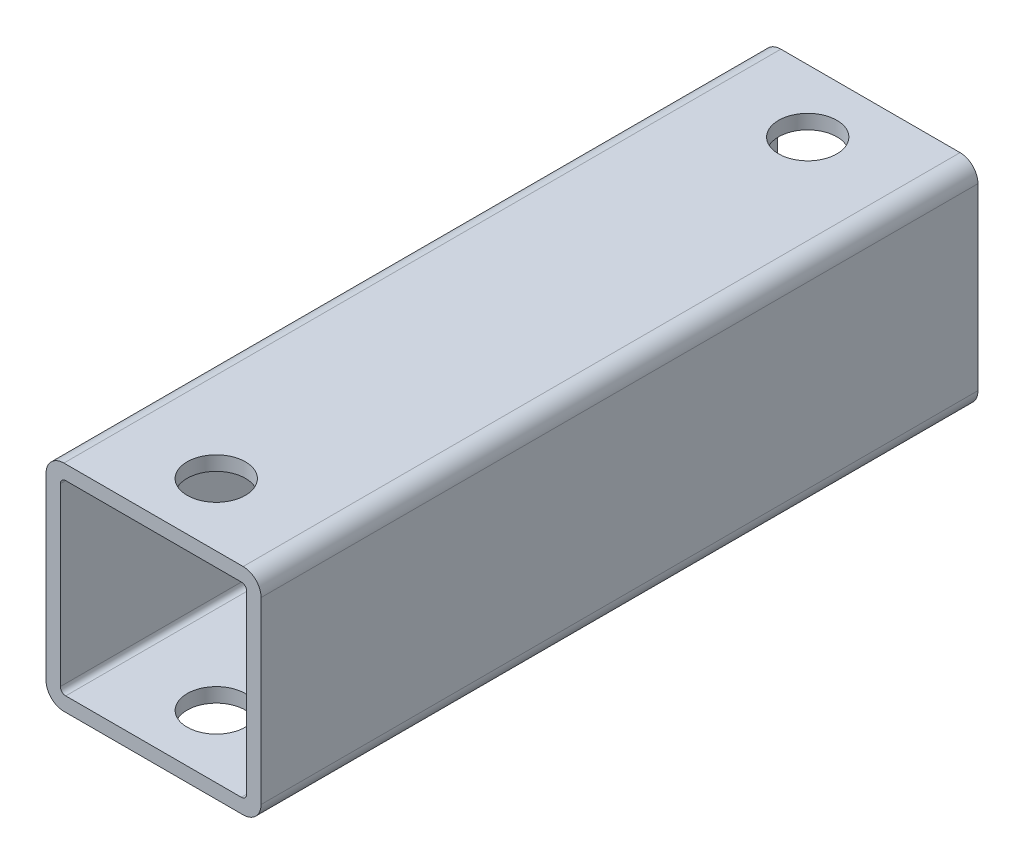
ISO-10303-21;
HEADER;
FILE_DESCRIPTION(('STEP AP214'),'2;1');
FILE_NAME('part.step','',(''),(''),'','','');
FILE_SCHEMA(('AUTOMOTIVE_DESIGN { 1 0 10303 214 1 1 1 1 }'));
ENDSEC;
DATA;
#1=APPLICATION_CONTEXT('core data for automotive mechanical design processes');
#2=APPLICATION_PROTOCOL_DEFINITION('international standard','automotive_design',2000,#1);
#3=PRODUCT_CONTEXT('',#1,'mechanical');
#4=PRODUCT('Part','Part','',(#3));
#5=PRODUCT_RELATED_PRODUCT_CATEGORY('part','',(#4));
#6=PRODUCT_DEFINITION_FORMATION('','',#4);
#7=PRODUCT_DEFINITION_CONTEXT('part definition',#1,'design');
#8=PRODUCT_DEFINITION('design','',#6,#7);
#9=PRODUCT_DEFINITION_SHAPE('','',#8);
#10=(LENGTH_UNIT() NAMED_UNIT(*) SI_UNIT(.MILLI.,.METRE.));
#11=(NAMED_UNIT(*) PLANE_ANGLE_UNIT() SI_UNIT($,.RADIAN.));
#12=(NAMED_UNIT(*) SI_UNIT($,.STERADIAN.) SOLID_ANGLE_UNIT());
#13=UNCERTAINTY_MEASURE_WITH_UNIT(LENGTH_MEASURE(1.E-05),#10,'distance_accuracy_value','');
#14=(GEOMETRIC_REPRESENTATION_CONTEXT(3) GLOBAL_UNCERTAINTY_ASSIGNED_CONTEXT((#13)) GLOBAL_UNIT_ASSIGNED_CONTEXT((#10,
#11,#12)) REPRESENTATION_CONTEXT('',''));
#15=CARTESIAN_POINT('',(0.,0.,0.));
#16=DIRECTION('',(0.,0.,1.));
#17=DIRECTION('',(1.,0.,0.));
#18=AXIS2_PLACEMENT_3D('',#15,#16,#17);
#19=CARTESIAN_POINT('',(-12.5,5.,71.));
#20=DIRECTION('',(0.,0.,-1.));
#21=DIRECTION('',(-1.,0.,0.));
#22=AXIS2_PLACEMENT_3D('',#19,#20,#21);
#23=CYLINDRICAL_SURFACE('',#22,0.999999999999998);
#24=CARTESIAN_POINT('',(-12.5,5.,71.));
#25=DIRECTION('',(0.,0.,-1.));
#26=DIRECTION('',(-1.,0.,0.));
#27=AXIS2_PLACEMENT_3D('',#24,#25,#26);
#28=CIRCLE('',#27,0.999999999999998);
#29=CARTESIAN_POINT('',(-13.5,5.,71.));
#30=VERTEX_POINT('',#29);
#31=CARTESIAN_POINT('',(-12.5,6.,71.));
#32=VERTEX_POINT('',#31);
#33=EDGE_CURVE('E95',#30,#32,#28,.T.);
#34=ORIENTED_EDGE('',*,*,#33,.T.);
#35=DIRECTION('',(0.,0.,1.));
#36=VECTOR('',#35,1.);
#37=CARTESIAN_POINT('',(-12.5,6.,51.));
#38=LINE('',#37,#36);
#39=CARTESIAN_POINT('',(-12.5,6.,31.));
#40=VERTEX_POINT('',#39);
#41=EDGE_CURVE('E92',#32,#40,#38,.F.);
#42=ORIENTED_EDGE('',*,*,#41,.T.);
#43=CARTESIAN_POINT('',(-12.5,5.,31.));
#44=DIRECTION('',(0.,0.,-1.));
#45=DIRECTION('',(-1.,0.,0.));
#46=AXIS2_PLACEMENT_3D('',#43,#44,#45);
#47=CIRCLE('',#46,0.999999999999998);
#48=CARTESIAN_POINT('',(-13.5,5.,31.));
#49=VERTEX_POINT('',#48);
#50=EDGE_CURVE('E21',#49,#40,#47,.T.);
#51=ORIENTED_EDGE('',*,*,#50,.F.);
#52=DIRECTION('',(0.,0.,-1.));
#53=VECTOR('',#52,1.);
#54=CARTESIAN_POINT('',(-13.5,5.,51.));
#55=LINE('',#54,#53);
#56=EDGE_CURVE('E159',#49,#30,#55,.F.);
#57=ORIENTED_EDGE('',*,*,#56,.T.);
#58=EDGE_LOOP('',(#34,#42,#51,#57));
#59=FACE_BOUND('',#58,.T.);
#60=ADVANCED_FACE('F17',(#59),#23,.T.);
#61=CARTESIAN_POINT('',(-12.5,-5.,71.));
#62=DIRECTION('',(0.,0.,-1.));
#63=DIRECTION('',(-1.,0.,0.));
#64=AXIS2_PLACEMENT_3D('',#61,#62,#63);
#65=CYLINDRICAL_SURFACE('',#64,1.);
#66=CARTESIAN_POINT('',(-12.5,-5.,71.));
#67=DIRECTION('',(0.,0.,-1.));
#68=DIRECTION('',(-1.,0.,0.));
#69=AXIS2_PLACEMENT_3D('',#66,#67,#68);
#70=CIRCLE('',#69,1.);
#71=CARTESIAN_POINT('',(-12.5,-6.,71.));
#72=VERTEX_POINT('',#71);
#73=CARTESIAN_POINT('',(-13.5,-5.,71.));
#74=VERTEX_POINT('',#73);
#75=EDGE_CURVE('E210',#72,#74,#70,.T.);
#76=ORIENTED_EDGE('',*,*,#75,.T.);
#77=DIRECTION('',(0.,0.,1.));
#78=VECTOR('',#77,1.);
#79=CARTESIAN_POINT('',(-13.5,-5.,51.));
#80=LINE('',#79,#78);
#81=CARTESIAN_POINT('',(-13.5,-5.,31.));
#82=VERTEX_POINT('',#81);
#83=EDGE_CURVE('E158',#74,#82,#80,.F.);
#84=ORIENTED_EDGE('',*,*,#83,.T.);
#85=CARTESIAN_POINT('',(-12.5,-5.,31.));
#86=DIRECTION('',(0.,0.,-1.));
#87=DIRECTION('',(-1.,0.,0.));
#88=AXIS2_PLACEMENT_3D('',#85,#86,#87);
#89=CIRCLE('',#88,1.);
#90=CARTESIAN_POINT('',(-12.5,-6.,31.));
#91=VERTEX_POINT('',#90);
#92=EDGE_CURVE('E89',#91,#82,#89,.T.);
#93=ORIENTED_EDGE('',*,*,#92,.F.);
#94=DIRECTION('',(0.,0.,-1.));
#95=VECTOR('',#94,1.);
#96=CARTESIAN_POINT('',(-12.5,-6.,51.));
#97=LINE('',#96,#95);
#98=EDGE_CURVE('E151',#91,#72,#97,.F.);
#99=ORIENTED_EDGE('',*,*,#98,.T.);
#100=EDGE_LOOP('',(#76,#84,#93,#99));
#101=FACE_BOUND('',#100,.T.);
#102=ADVANCED_FACE('F235',(#101),#65,.T.);
#103=CARTESIAN_POINT('',(-2.5,5.,71.));
#104=DIRECTION('',(0.,0.,-1.));
#105=DIRECTION('',(-1.,0.,0.));
#106=AXIS2_PLACEMENT_3D('',#103,#104,#105);
#107=CYLINDRICAL_SURFACE('',#106,1.);
#108=CARTESIAN_POINT('',(-2.5,5.,71.));
#109=DIRECTION('',(0.,0.,-1.));
#110=DIRECTION('',(-1.,0.,0.));
#111=AXIS2_PLACEMENT_3D('',#108,#109,#110);
#112=CIRCLE('',#111,1.);
#113=CARTESIAN_POINT('',(-2.5,6.,71.));
#114=VERTEX_POINT('',#113);
#115=CARTESIAN_POINT('',(-1.5,5.,71.));
#116=VERTEX_POINT('',#115);
#117=EDGE_CURVE('E216',#114,#116,#112,.T.);
#118=ORIENTED_EDGE('',*,*,#117,.T.);
#119=DIRECTION('',(0.,0.,1.));
#120=VECTOR('',#119,1.);
#121=CARTESIAN_POINT('',(-1.5,5.,51.));
#122=LINE('',#121,#120);
#123=CARTESIAN_POINT('',(-1.5,5.,31.));
#124=VERTEX_POINT('',#123);
#125=EDGE_CURVE('E147',#116,#124,#122,.F.);
#126=ORIENTED_EDGE('',*,*,#125,.T.);
#127=CARTESIAN_POINT('',(-2.5,5.,31.));
#128=DIRECTION('',(0.,0.,-1.));
#129=DIRECTION('',(-1.,0.,0.));
#130=AXIS2_PLACEMENT_3D('',#127,#128,#129);
#131=CIRCLE('',#130,1.);
#132=CARTESIAN_POINT('',(-2.5,6.,31.));
#133=VERTEX_POINT('',#132);
#134=EDGE_CURVE('E229',#133,#124,#131,.T.);
#135=ORIENTED_EDGE('',*,*,#134,.F.);
#136=DIRECTION('',(0.,0.,-1.));
#137=VECTOR('',#136,1.);
#138=CARTESIAN_POINT('',(-2.5,6.,51.));
#139=LINE('',#138,#137);
#140=EDGE_CURVE('E105',#133,#114,#139,.F.);
#141=ORIENTED_EDGE('',*,*,#140,.T.);
#142=EDGE_LOOP('',(#118,#126,#135,#141));
#143=FACE_BOUND('',#142,.T.);
#144=ADVANCED_FACE('F297',(#143),#107,.T.);
#145=CARTESIAN_POINT('',(-2.5,-5.,71.));
#146=DIRECTION('',(0.,0.,-1.));
#147=DIRECTION('',(-1.,0.,0.));
#148=AXIS2_PLACEMENT_3D('',#145,#146,#147);
#149=CYLINDRICAL_SURFACE('',#148,1.);
#150=CARTESIAN_POINT('',(-2.5,-5.,71.));
#151=DIRECTION('',(0.,0.,-1.));
#152=DIRECTION('',(-1.,0.,0.));
#153=AXIS2_PLACEMENT_3D('',#150,#151,#152);
#154=CIRCLE('',#153,1.);
#155=CARTESIAN_POINT('',(-1.5,-5.,71.));
#156=VERTEX_POINT('',#155);
#157=CARTESIAN_POINT('',(-2.5,-6.,71.));
#158=VERTEX_POINT('',#157);
#159=EDGE_CURVE('E213',#156,#158,#154,.T.);
#160=ORIENTED_EDGE('',*,*,#159,.T.);
#161=DIRECTION('',(0.,0.,1.));
#162=VECTOR('',#161,1.);
#163=CARTESIAN_POINT('',(-2.5,-6.,51.));
#164=LINE('',#163,#162);
#165=CARTESIAN_POINT('',(-2.5,-6.,31.));
#166=VERTEX_POINT('',#165);
#167=EDGE_CURVE('E155',#158,#166,#164,.F.);
#168=ORIENTED_EDGE('',*,*,#167,.T.);
#169=CARTESIAN_POINT('',(-2.5,-5.,31.));
#170=DIRECTION('',(0.,0.,-1.));
#171=DIRECTION('',(-1.,0.,0.));
#172=AXIS2_PLACEMENT_3D('',#169,#170,#171);
#173=CIRCLE('',#172,1.);
#174=CARTESIAN_POINT('',(-1.5,-5.,31.));
#175=VERTEX_POINT('',#174);
#176=EDGE_CURVE('E227',#175,#166,#173,.T.);
#177=ORIENTED_EDGE('',*,*,#176,.F.);
#178=DIRECTION('',(0.,0.,-1.));
#179=VECTOR('',#178,1.);
#180=CARTESIAN_POINT('',(-1.5,-5.,51.));
#181=LINE('',#180,#179);
#182=EDGE_CURVE('E144',#175,#156,#181,.F.);
#183=ORIENTED_EDGE('',*,*,#182,.T.);
#184=EDGE_LOOP('',(#160,#168,#177,#183));
#185=FACE_BOUND('',#184,.T.);
#186=ADVANCED_FACE('F295',(#185),#149,.T.);
#187=CARTESIAN_POINT('',(-2.6,-4.9,31.));
#188=DIRECTION('',(0.,0.,1.));
#189=DIRECTION('',(1.,0.,0.));
#190=AXIS2_PLACEMENT_3D('',#187,#188,#189);
#191=CYLINDRICAL_SURFACE('',#190,0.3);
#192=DIRECTION('',(0.,0.,1.));
#193=VECTOR('',#192,1.);
#194=CARTESIAN_POINT('',(-2.3,-4.9,51.));
#195=LINE('',#194,#193);
#196=CARTESIAN_POINT('',(-2.3,-4.9,71.));
#197=VERTEX_POINT('',#196);
#198=CARTESIAN_POINT('',(-2.3,-4.9,31.));
#199=VERTEX_POINT('',#198);
#200=EDGE_CURVE('E140',#197,#199,#195,.F.);
#201=ORIENTED_EDGE('',*,*,#200,.T.);
#202=CARTESIAN_POINT('',(-2.6,-4.9,31.));
#203=DIRECTION('',(0.,0.,1.));
#204=DIRECTION('',(1.,0.,0.));
#205=AXIS2_PLACEMENT_3D('',#202,#203,#204);
#206=CIRCLE('',#205,0.3);
#207=CARTESIAN_POINT('',(-2.6,-5.2,31.));
#208=VERTEX_POINT('',#207);
#209=EDGE_CURVE('E225',#208,#199,#206,.T.);
#210=ORIENTED_EDGE('',*,*,#209,.F.);
#211=DIRECTION('',(0.,0.,-1.));
#212=VECTOR('',#211,1.);
#213=CARTESIAN_POINT('',(-2.6,-5.2,51.));
#214=LINE('',#213,#212);
#215=CARTESIAN_POINT('',(-2.6,-5.2,71.));
#216=VERTEX_POINT('',#215);
#217=EDGE_CURVE('E129',#208,#216,#214,.F.);
#218=ORIENTED_EDGE('',*,*,#217,.T.);
#219=CARTESIAN_POINT('',(-2.6,-4.9,71.));
#220=DIRECTION('',(0.,0.,1.));
#221=DIRECTION('',(1.,0.,0.));
#222=AXIS2_PLACEMENT_3D('',#219,#220,#221);
#223=CIRCLE('',#222,0.3);
#224=EDGE_CURVE('E206',#216,#197,#223,.T.);
#225=ORIENTED_EDGE('',*,*,#224,.T.);
#226=EDGE_LOOP('',(#201,#210,#218,#225));
#227=FACE_BOUND('',#226,.T.);
#228=ADVANCED_FACE('F305',(#227),#191,.F.);
#229=CARTESIAN_POINT('',(-7.5,-6.,34.5));
#230=DIRECTION('',(0.,1.,0.));
#231=DIRECTION('',(0.,0.,1.));
#232=AXIS2_PLACEMENT_3D('',#229,#230,#231);
#233=CYLINDRICAL_SURFACE('',#232,1.62499999999999);
#234=CARTESIAN_POINT('',(-7.5,-6.,34.5));
#235=DIRECTION('',(0.,1.,0.));
#236=DIRECTION('',(0.,0.,1.));
#237=AXIS2_PLACEMENT_3D('',#234,#235,#236);
#238=CIRCLE('',#237,1.62499999999999);
#239=CARTESIAN_POINT('',(-7.5,-6.,36.125));
#240=VERTEX_POINT('',#239);
#241=EDGE_CURVE('E180',#240,#240,#238,.F.);
#242=ORIENTED_EDGE('',*,*,#241,.T.);
#243=EDGE_LOOP('',(#242));
#244=FACE_BOUND('',#243,.T.);
#245=CARTESIAN_POINT('',(-7.5,-5.2,34.5));
#246=DIRECTION('',(0.,1.,0.));
#247=DIRECTION('',(0.,0.,1.));
#248=AXIS2_PLACEMENT_3D('',#245,#246,#247);
#249=CIRCLE('',#248,1.62499999999999);
#250=CARTESIAN_POINT('',(-7.5,-5.2,36.125));
#251=VERTEX_POINT('',#250);
#252=EDGE_CURVE('E173',#251,#251,#249,.T.);
#253=ORIENTED_EDGE('',*,*,#252,.T.);
#254=EDGE_LOOP('',(#253));
#255=FACE_BOUND('',#254,.T.);
#256=ADVANCED_FACE('F375',(#244,#255),#233,.F.);
#257=CARTESIAN_POINT('',(-7.5,-6.,67.5));
#258=DIRECTION('',(0.,1.,0.));
#259=DIRECTION('',(0.,0.,1.));
#260=AXIS2_PLACEMENT_3D('',#257,#258,#259);
#261=CYLINDRICAL_SURFACE('',#260,1.625);
#262=CARTESIAN_POINT('',(-7.5,-6.,67.5));
#263=DIRECTION('',(0.,1.,0.));
#264=DIRECTION('',(0.,0.,1.));
#265=AXIS2_PLACEMENT_3D('',#262,#263,#264);
#266=CIRCLE('',#265,1.625);
#267=CARTESIAN_POINT('',(-7.5,-6.,69.125));
#268=VERTEX_POINT('',#267);
#269=EDGE_CURVE('E150',#268,#268,#266,.F.);
#270=ORIENTED_EDGE('',*,*,#269,.T.);
#271=EDGE_LOOP('',(#270));
#272=FACE_BOUND('',#271,.T.);
#273=CARTESIAN_POINT('',(-7.5,-5.2,67.5));
#274=DIRECTION('',(0.,1.,0.));
#275=DIRECTION('',(0.,0.,1.));
#276=AXIS2_PLACEMENT_3D('',#273,#274,#275);
#277=CIRCLE('',#276,1.625);
#278=CARTESIAN_POINT('',(-7.5,-5.2,69.125));
#279=VERTEX_POINT('',#278);
#280=EDGE_CURVE('E126',#279,#279,#277,.T.);
#281=ORIENTED_EDGE('',*,*,#280,.T.);
#282=EDGE_LOOP('',(#281));
#283=FACE_BOUND('',#282,.T.);
#284=ADVANCED_FACE('F385',(#272,#283),#261,.F.);
#285=CARTESIAN_POINT('',(-12.4,-4.9,31.));
#286=DIRECTION('',(0.,0.,1.));
#287=DIRECTION('',(1.,0.,0.));
#288=AXIS2_PLACEMENT_3D('',#285,#286,#287);
#289=CYLINDRICAL_SURFACE('',#288,0.299999999999998);
#290=DIRECTION('',(0.,0.,1.));
#291=VECTOR('',#290,1.);
#292=CARTESIAN_POINT('',(-12.4,-5.2,51.));
#293=LINE('',#292,#291);
#294=CARTESIAN_POINT('',(-12.4,-5.2,71.));
#295=VERTEX_POINT('',#294);
#296=CARTESIAN_POINT('',(-12.4,-5.2,31.));
#297=VERTEX_POINT('',#296);
#298=EDGE_CURVE('E133',#295,#297,#293,.F.);
#299=ORIENTED_EDGE('',*,*,#298,.T.);
#300=CARTESIAN_POINT('',(-12.4,-4.9,31.));
#301=DIRECTION('',(0.,0.,1.));
#302=DIRECTION('',(1.,0.,0.));
#303=AXIS2_PLACEMENT_3D('',#300,#301,#302);
#304=CIRCLE('',#303,0.299999999999998);
#305=CARTESIAN_POINT('',(-12.7,-4.9,31.));
#306=VERTEX_POINT('',#305);
#307=EDGE_CURVE('E223',#306,#297,#304,.T.);
#308=ORIENTED_EDGE('',*,*,#307,.F.);
#309=DIRECTION('',(0.,0.,-1.));
#310=VECTOR('',#309,1.);
#311=CARTESIAN_POINT('',(-12.7,-4.9,51.));
#312=LINE('',#311,#310);
#313=CARTESIAN_POINT('',(-12.7,-4.9,71.));
#314=VERTEX_POINT('',#313);
#315=EDGE_CURVE('E122',#306,#314,#312,.F.);
#316=ORIENTED_EDGE('',*,*,#315,.T.);
#317=CARTESIAN_POINT('',(-12.4,-4.9,71.));
#318=DIRECTION('',(0.,0.,1.));
#319=DIRECTION('',(1.,0.,0.));
#320=AXIS2_PLACEMENT_3D('',#317,#318,#319);
#321=CIRCLE('',#320,0.299999999999998);
#322=EDGE_CURVE('E165',#314,#295,#321,.T.);
#323=ORIENTED_EDGE('',*,*,#322,.T.);
#324=EDGE_LOOP('',(#299,#308,#316,#323));
#325=FACE_BOUND('',#324,.T.);
#326=ADVANCED_FACE('F395',(#325),#289,.F.);
#327=CARTESIAN_POINT('',(-2.6,4.9,31.));
#328=DIRECTION('',(0.,0.,1.));
#329=DIRECTION('',(1.,0.,0.));
#330=AXIS2_PLACEMENT_3D('',#327,#328,#329);
#331=CYLINDRICAL_SURFACE('',#330,0.3);
#332=DIRECTION('',(0.,0.,1.));
#333=VECTOR('',#332,1.);
#334=CARTESIAN_POINT('',(-2.6,5.2,51.));
#335=LINE('',#334,#333);
#336=CARTESIAN_POINT('',(-2.6,5.2,71.));
#337=VERTEX_POINT('',#336);
#338=CARTESIAN_POINT('',(-2.6,5.2,31.));
#339=VERTEX_POINT('',#338);
#340=EDGE_CURVE('E119',#337,#339,#335,.F.);
#341=ORIENTED_EDGE('',*,*,#340,.T.);
#342=CARTESIAN_POINT('',(-2.6,4.9,31.));
#343=DIRECTION('',(0.,0.,1.));
#344=DIRECTION('',(1.,0.,0.));
#345=AXIS2_PLACEMENT_3D('',#342,#343,#344);
#346=CIRCLE('',#345,0.3);
#347=CARTESIAN_POINT('',(-2.3,4.9,31.));
#348=VERTEX_POINT('',#347);
#349=EDGE_CURVE('E36',#348,#339,#346,.T.);
#350=ORIENTED_EDGE('',*,*,#349,.F.);
#351=DIRECTION('',(0.,0.,-1.));
#352=VECTOR('',#351,1.);
#353=CARTESIAN_POINT('',(-2.3,4.9,51.));
#354=LINE('',#353,#352);
#355=CARTESIAN_POINT('',(-2.3,4.9,71.));
#356=VERTEX_POINT('',#355);
#357=EDGE_CURVE('E137',#348,#356,#354,.F.);
#358=ORIENTED_EDGE('',*,*,#357,.T.);
#359=CARTESIAN_POINT('',(-2.6,4.9,71.));
#360=DIRECTION('',(0.,0.,1.));
#361=DIRECTION('',(1.,0.,0.));
#362=AXIS2_PLACEMENT_3D('',#359,#360,#361);
#363=CIRCLE('',#362,0.3);
#364=EDGE_CURVE('E203',#356,#337,#363,.T.);
#365=ORIENTED_EDGE('',*,*,#364,.T.);
#366=EDGE_LOOP('',(#341,#350,#358,#365));
#367=FACE_BOUND('',#366,.T.);
#368=ADVANCED_FACE('F405',(#367),#331,.F.);
#369=CARTESIAN_POINT('',(-12.4,4.9,31.));
#370=DIRECTION('',(0.,0.,1.));
#371=DIRECTION('',(1.,0.,0.));
#372=AXIS2_PLACEMENT_3D('',#369,#370,#371);
#373=CYLINDRICAL_SURFACE('',#372,0.3);
#374=DIRECTION('',(0.,0.,1.));
#375=VECTOR('',#374,1.);
#376=CARTESIAN_POINT('',(-12.7,4.9,51.));
#377=LINE('',#376,#375);
#378=CARTESIAN_POINT('',(-12.7,4.9,71.));
#379=VERTEX_POINT('',#378);
#380=CARTESIAN_POINT('',(-12.7,4.9,31.));
#381=VERTEX_POINT('',#380);
#382=EDGE_CURVE('E121',#379,#381,#377,.F.);
#383=ORIENTED_EDGE('',*,*,#382,.T.);
#384=CARTESIAN_POINT('',(-12.4,4.9,31.));
#385=DIRECTION('',(0.,0.,1.));
#386=DIRECTION('',(1.,0.,0.));
#387=AXIS2_PLACEMENT_3D('',#384,#385,#386);
#388=CIRCLE('',#387,0.3);
#389=CARTESIAN_POINT('',(-12.4,5.2,31.));
#390=VERTEX_POINT('',#389);
#391=EDGE_CURVE('E219',#390,#381,#388,.T.);
#392=ORIENTED_EDGE('',*,*,#391,.F.);
#393=DIRECTION('',(0.,0.,-1.));
#394=VECTOR('',#393,1.);
#395=CARTESIAN_POINT('',(-12.4,5.2,51.));
#396=LINE('',#395,#394);
#397=CARTESIAN_POINT('',(-12.4,5.2,71.));
#398=VERTEX_POINT('',#397);
#399=EDGE_CURVE('E115',#390,#398,#396,.F.);
#400=ORIENTED_EDGE('',*,*,#399,.T.);
#401=CARTESIAN_POINT('',(-12.4,4.9,71.));
#402=DIRECTION('',(0.,0.,1.));
#403=DIRECTION('',(1.,0.,0.));
#404=AXIS2_PLACEMENT_3D('',#401,#402,#403);
#405=CIRCLE('',#404,0.3);
#406=EDGE_CURVE('E200',#398,#379,#405,.T.);
#407=ORIENTED_EDGE('',*,*,#406,.T.);
#408=EDGE_LOOP('',(#383,#392,#400,#407));
#409=FACE_BOUND('',#408,.T.);
#410=ADVANCED_FACE('F268',(#409),#373,.F.);
#411=CARTESIAN_POINT('',(-13.74,6.24,71.));
#412=DIRECTION('',(0.,0.,1.));
#413=DIRECTION('',(0.,-1.,0.));
#414=AXIS2_PLACEMENT_3D('',#411,#412,#413);
#415=PLANE('',#414);
#416=DIRECTION('',(0.,-1.,0.));
#417=VECTOR('',#416,1.);
#418=CARTESIAN_POINT('',(-12.7,0.,71.));
#419=LINE('',#418,#417);
#420=EDGE_CURVE('E125',#314,#379,#419,.F.);
#421=ORIENTED_EDGE('',*,*,#420,.T.);
#422=ORIENTED_EDGE('',*,*,#406,.F.);
#423=DIRECTION('',(-1.,0.,0.));
#424=VECTOR('',#423,1.);
#425=CARTESIAN_POINT('',(-7.5,5.2,71.));
#426=LINE('',#425,#424);
#427=EDGE_CURVE('E118',#398,#337,#426,.F.);
#428=ORIENTED_EDGE('',*,*,#427,.T.);
#429=ORIENTED_EDGE('',*,*,#364,.F.);
#430=DIRECTION('',(0.,1.,0.));
#431=VECTOR('',#430,1.);
#432=CARTESIAN_POINT('',(-2.3,0.,71.));
#433=LINE('',#432,#431);
#434=EDGE_CURVE('E136',#356,#197,#433,.F.);
#435=ORIENTED_EDGE('',*,*,#434,.T.);
#436=ORIENTED_EDGE('',*,*,#224,.F.);
#437=DIRECTION('',(1.,0.,0.));
#438=VECTOR('',#437,1.);
#439=CARTESIAN_POINT('',(-7.5,-5.2,71.));
#440=LINE('',#439,#438);
#441=EDGE_CURVE('E132',#216,#295,#440,.F.);
#442=ORIENTED_EDGE('',*,*,#441,.T.);
#443=ORIENTED_EDGE('',*,*,#322,.F.);
#444=EDGE_LOOP('',(#421,#422,#428,#429,#435,#436,#442,#443));
#445=FACE_BOUND('',#444,.T.);
#446=ORIENTED_EDGE('',*,*,#33,.F.);
#447=DIRECTION('',(0.,1.,0.));
#448=VECTOR('',#447,1.);
#449=CARTESIAN_POINT('',(-13.5,0.,71.));
#450=LINE('',#449,#448);
#451=EDGE_CURVE('E161',#30,#74,#450,.F.);
#452=ORIENTED_EDGE('',*,*,#451,.T.);
#453=ORIENTED_EDGE('',*,*,#75,.F.);
#454=DIRECTION('',(-1.,0.,0.));
#455=VECTOR('',#454,1.);
#456=CARTESIAN_POINT('',(-7.5,-6.,71.));
#457=LINE('',#456,#455);
#458=EDGE_CURVE('E154',#72,#158,#457,.F.);
#459=ORIENTED_EDGE('',*,*,#458,.T.);
#460=ORIENTED_EDGE('',*,*,#159,.F.);
#461=DIRECTION('',(0.,-1.,0.));
#462=VECTOR('',#461,1.);
#463=CARTESIAN_POINT('',(-1.5,0.,71.));
#464=LINE('',#463,#462);
#465=EDGE_CURVE('E143',#156,#116,#464,.F.);
#466=ORIENTED_EDGE('',*,*,#465,.T.);
#467=ORIENTED_EDGE('',*,*,#117,.F.);
#468=DIRECTION('',(1.,0.,0.));
#469=VECTOR('',#468,1.);
#470=CARTESIAN_POINT('',(-7.5,6.,71.));
#471=LINE('',#470,#469);
#472=EDGE_CURVE('E100',#114,#32,#471,.F.);
#473=ORIENTED_EDGE('',*,*,#472,.T.);
#474=EDGE_LOOP('',(#446,#452,#453,#459,#460,#466,#467,#473));
#475=FACE_BOUND('',#474,.T.);
#476=ADVANCED_FACE('F288',(#445,#475),#415,.T.);
#477=CARTESIAN_POINT('',(-7.5,5.2,34.5));
#478=DIRECTION('',(0.,1.,0.));
#479=DIRECTION('',(0.,0.,1.));
#480=AXIS2_PLACEMENT_3D('',#477,#478,#479);
#481=CYLINDRICAL_SURFACE('',#480,1.62499999999999);
#482=CARTESIAN_POINT('',(-7.5,6.,34.5));
#483=DIRECTION('',(0.,1.,0.));
#484=DIRECTION('',(0.,0.,1.));
#485=AXIS2_PLACEMENT_3D('',#482,#483,#484);
#486=CIRCLE('',#485,1.62499999999999);
#487=CARTESIAN_POINT('',(-7.5,6.,36.125));
#488=VERTEX_POINT('',#487);
#489=EDGE_CURVE('E99',#488,#488,#486,.T.);
#490=ORIENTED_EDGE('',*,*,#489,.T.);
#491=EDGE_LOOP('',(#490));
#492=FACE_BOUND('',#491,.T.);
#493=CARTESIAN_POINT('',(-7.5,5.2,34.5));
#494=DIRECTION('',(0.,1.,0.));
#495=DIRECTION('',(0.,0.,1.));
#496=AXIS2_PLACEMENT_3D('',#493,#494,#495);
#497=CIRCLE('',#496,1.62499999999999);
#498=CARTESIAN_POINT('',(-7.5,5.2,36.125));
#499=VERTEX_POINT('',#498);
#500=EDGE_CURVE('E111',#499,#499,#497,.F.);
#501=ORIENTED_EDGE('',*,*,#500,.T.);
#502=EDGE_LOOP('',(#501));
#503=FACE_BOUND('',#502,.T.);
#504=ADVANCED_FACE('F342',(#492,#503),#481,.F.);
#505=CARTESIAN_POINT('',(-7.5,5.2,67.5));
#506=DIRECTION('',(0.,1.,0.));
#507=DIRECTION('',(0.,0.,1.));
#508=AXIS2_PLACEMENT_3D('',#505,#506,#507);
#509=CYLINDRICAL_SURFACE('',#508,1.625);
#510=CARTESIAN_POINT('',(-7.5,6.,67.5));
#511=DIRECTION('',(0.,1.,0.));
#512=DIRECTION('',(0.,0.,1.));
#513=AXIS2_PLACEMENT_3D('',#510,#511,#512);
#514=CIRCLE('',#513,1.625);
#515=CARTESIAN_POINT('',(-7.5,6.,69.125));
#516=VERTEX_POINT('',#515);
#517=EDGE_CURVE('E162',#516,#516,#514,.T.);
#518=ORIENTED_EDGE('',*,*,#517,.T.);
#519=EDGE_LOOP('',(#518));
#520=FACE_BOUND('',#519,.T.);
#521=CARTESIAN_POINT('',(-7.5,5.2,67.5));
#522=DIRECTION('',(0.,1.,0.));
#523=DIRECTION('',(0.,0.,1.));
#524=AXIS2_PLACEMENT_3D('',#521,#522,#523);
#525=CIRCLE('',#524,1.625);
#526=CARTESIAN_POINT('',(-7.5,5.2,69.125));
#527=VERTEX_POINT('',#526);
#528=EDGE_CURVE('E106',#527,#527,#525,.F.);
#529=ORIENTED_EDGE('',*,*,#528,.T.);
#530=EDGE_LOOP('',(#529));
#531=FACE_BOUND('',#530,.T.);
#532=ADVANCED_FACE('F338',(#520,#531),#509,.F.);
#533=CARTESIAN_POINT('',(-2.3,6.,30.2));
#534=DIRECTION('',(0.,1.,0.));
#535=DIRECTION('',(-1.,0.,0.));
#536=AXIS2_PLACEMENT_3D('',#533,#534,#535);
#537=PLANE('',#536);
#538=ORIENTED_EDGE('',*,*,#517,.F.);
#539=EDGE_LOOP('',(#538));
#540=FACE_BOUND('',#539,.T.);
#541=ORIENTED_EDGE('',*,*,#489,.F.);
#542=EDGE_LOOP('',(#541));
#543=FACE_BOUND('',#542,.T.);
#544=ORIENTED_EDGE('',*,*,#41,.F.);
#545=ORIENTED_EDGE('',*,*,#472,.F.);
#546=ORIENTED_EDGE('',*,*,#140,.F.);
#547=DIRECTION('',(-1.,0.,0.));
#548=VECTOR('',#547,1.);
#549=CARTESIAN_POINT('',(-7.5,6.,31.));
#550=LINE('',#549,#548);
#551=EDGE_CURVE('E86',#133,#40,#550,.T.);
#552=ORIENTED_EDGE('',*,*,#551,.T.);
#553=EDGE_LOOP('',(#544,#545,#546,#552));
#554=FACE_BOUND('',#553,.T.);
#555=ADVANCED_FACE('F103',(#540,#543,#554),#537,.T.);
#556=CARTESIAN_POINT('',(-13.5,5.2,30.2));
#557=DIRECTION('',(-1.,0.,0.));
#558=DIRECTION('',(0.,-1.,0.));
#559=AXIS2_PLACEMENT_3D('',#556,#557,#558);
#560=PLANE('',#559);
#561=ORIENTED_EDGE('',*,*,#83,.F.);
#562=ORIENTED_EDGE('',*,*,#451,.F.);
#563=ORIENTED_EDGE('',*,*,#56,.F.);
#564=DIRECTION('',(0.,-1.,0.));
#565=VECTOR('',#564,1.);
#566=CARTESIAN_POINT('',(-13.5,0.,31.));
#567=LINE('',#566,#565);
#568=EDGE_CURVE('E88',#49,#82,#567,.T.);
#569=ORIENTED_EDGE('',*,*,#568,.T.);
#570=EDGE_LOOP('',(#561,#562,#563,#569));
#571=FACE_BOUND('',#570,.T.);
#572=ADVANCED_FACE('F240',(#571),#560,.T.);
#573=CARTESIAN_POINT('',(-12.7,-6.,30.2));
#574=DIRECTION('',(0.,-1.,0.));
#575=DIRECTION('',(1.,0.,0.));
#576=AXIS2_PLACEMENT_3D('',#573,#574,#575);
#577=PLANE('',#576);
#578=ORIENTED_EDGE('',*,*,#269,.F.);
#579=EDGE_LOOP('',(#578));
#580=FACE_BOUND('',#579,.T.);
#581=ORIENTED_EDGE('',*,*,#241,.F.);
#582=EDGE_LOOP('',(#581));
#583=FACE_BOUND('',#582,.T.);
#584=ORIENTED_EDGE('',*,*,#98,.F.);
#585=DIRECTION('',(1.,0.,0.));
#586=VECTOR('',#585,1.);
#587=CARTESIAN_POINT('',(-7.5,-6.,31.));
#588=LINE('',#587,#586);
#589=EDGE_CURVE('E108',#91,#166,#588,.T.);
#590=ORIENTED_EDGE('',*,*,#589,.T.);
#591=ORIENTED_EDGE('',*,*,#167,.F.);
#592=ORIENTED_EDGE('',*,*,#458,.F.);
#593=EDGE_LOOP('',(#584,#590,#591,#592));
#594=FACE_BOUND('',#593,.T.);
#595=ADVANCED_FACE('F286',(#580,#583,#594),#577,.T.);
#596=CARTESIAN_POINT('',(-1.5,-5.2,30.2));
#597=DIRECTION('',(1.,0.,0.));
#598=DIRECTION('',(0.,1.,0.));
#599=AXIS2_PLACEMENT_3D('',#596,#597,#598);
#600=PLANE('',#599);
#601=ORIENTED_EDGE('',*,*,#182,.F.);
#602=DIRECTION('',(0.,1.,0.));
#603=VECTOR('',#602,1.);
#604=CARTESIAN_POINT('',(-1.5,0.,31.));
#605=LINE('',#604,#603);
#606=EDGE_CURVE('E283',#175,#124,#605,.T.);
#607=ORIENTED_EDGE('',*,*,#606,.T.);
#608=ORIENTED_EDGE('',*,*,#125,.F.);
#609=ORIENTED_EDGE('',*,*,#465,.F.);
#610=EDGE_LOOP('',(#601,#607,#608,#609));
#611=FACE_BOUND('',#610,.T.);
#612=ADVANCED_FACE('F293',(#611),#600,.T.);
#613=CARTESIAN_POINT('',(-2.3,5.096,30.2));
#614=DIRECTION('',(-1.,0.,0.));
#615=DIRECTION('',(0.,-1.,0.));
#616=AXIS2_PLACEMENT_3D('',#613,#614,#615);
#617=PLANE('',#616);
#618=ORIENTED_EDGE('',*,*,#357,.F.);
#619=DIRECTION('',(0.,-1.,0.));
#620=VECTOR('',#619,1.);
#621=CARTESIAN_POINT('',(-2.3,0.,31.));
#622=LINE('',#621,#620);
#623=EDGE_CURVE('E278',#348,#199,#622,.T.);
#624=ORIENTED_EDGE('',*,*,#623,.T.);
#625=ORIENTED_EDGE('',*,*,#200,.F.);
#626=ORIENTED_EDGE('',*,*,#434,.F.);
#627=EDGE_LOOP('',(#618,#624,#625,#626));
#628=FACE_BOUND('',#627,.T.);
#629=ADVANCED_FACE('F324',(#628),#617,.T.);
#630=CARTESIAN_POINT('',(-2.404,-5.2,30.2));
#631=DIRECTION('',(0.,1.,0.));
#632=DIRECTION('',(-1.,0.,0.));
#633=AXIS2_PLACEMENT_3D('',#630,#631,#632);
#634=PLANE('',#633);
#635=ORIENTED_EDGE('',*,*,#280,.F.);
#636=EDGE_LOOP('',(#635));
#637=FACE_BOUND('',#636,.T.);
#638=ORIENTED_EDGE('',*,*,#252,.F.);
#639=EDGE_LOOP('',(#638));
#640=FACE_BOUND('',#639,.T.);
#641=ORIENTED_EDGE('',*,*,#217,.F.);
#642=DIRECTION('',(-1.,0.,0.));
#643=VECTOR('',#642,1.);
#644=CARTESIAN_POINT('',(-7.5,-5.2,31.));
#645=LINE('',#644,#643);
#646=EDGE_CURVE('E275',#208,#297,#645,.T.);
#647=ORIENTED_EDGE('',*,*,#646,.T.);
#648=ORIENTED_EDGE('',*,*,#298,.F.);
#649=ORIENTED_EDGE('',*,*,#441,.F.);
#650=EDGE_LOOP('',(#641,#647,#648,#649));
#651=FACE_BOUND('',#650,.T.);
#652=ADVANCED_FACE('F317',(#637,#640,#651),#634,.T.);
#653=CARTESIAN_POINT('',(-12.7,-5.096,30.2));
#654=DIRECTION('',(1.,0.,0.));
#655=DIRECTION('',(0.,1.,0.));
#656=AXIS2_PLACEMENT_3D('',#653,#654,#655);
#657=PLANE('',#656);
#658=ORIENTED_EDGE('',*,*,#382,.F.);
#659=ORIENTED_EDGE('',*,*,#420,.F.);
#660=ORIENTED_EDGE('',*,*,#315,.F.);
#661=DIRECTION('',(0.,1.,0.));
#662=VECTOR('',#661,1.);
#663=CARTESIAN_POINT('',(-12.7,0.,31.));
#664=LINE('',#663,#662);
#665=EDGE_CURVE('E27',#306,#381,#664,.T.);
#666=ORIENTED_EDGE('',*,*,#665,.T.);
#667=EDGE_LOOP('',(#658,#659,#660,#666));
#668=FACE_BOUND('',#667,.T.);
#669=ADVANCED_FACE('F274',(#668),#657,.T.);
#670=CARTESIAN_POINT('',(-12.596,5.2,30.2));
#671=DIRECTION('',(0.,-1.,0.));
#672=DIRECTION('',(1.,0.,0.));
#673=AXIS2_PLACEMENT_3D('',#670,#671,#672);
#674=PLANE('',#673);
#675=ORIENTED_EDGE('',*,*,#528,.F.);
#676=EDGE_LOOP('',(#675));
#677=FACE_BOUND('',#676,.T.);
#678=ORIENTED_EDGE('',*,*,#500,.F.);
#679=EDGE_LOOP('',(#678));
#680=FACE_BOUND('',#679,.T.);
#681=ORIENTED_EDGE('',*,*,#399,.F.);
#682=DIRECTION('',(1.,0.,0.));
#683=VECTOR('',#682,1.);
#684=CARTESIAN_POINT('',(-7.5,5.2,31.));
#685=LINE('',#684,#683);
#686=EDGE_CURVE('E11',#390,#339,#685,.T.);
#687=ORIENTED_EDGE('',*,*,#686,.T.);
#688=ORIENTED_EDGE('',*,*,#340,.F.);
#689=ORIENTED_EDGE('',*,*,#427,.F.);
#690=EDGE_LOOP('',(#681,#687,#688,#689));
#691=FACE_BOUND('',#690,.T.);
#692=ADVANCED_FACE('F309',(#677,#680,#691),#674,.T.);
#693=CARTESIAN_POINT('',(-13.74,6.24,31.));
#694=DIRECTION('',(0.,0.,1.));
#695=DIRECTION('',(0.,-1.,0.));
#696=AXIS2_PLACEMENT_3D('',#693,#694,#695);
#697=PLANE('',#696);
#698=ORIENTED_EDGE('',*,*,#686,.F.);
#699=ORIENTED_EDGE('',*,*,#391,.T.);
#700=ORIENTED_EDGE('',*,*,#665,.F.);
#701=ORIENTED_EDGE('',*,*,#307,.T.);
#702=ORIENTED_EDGE('',*,*,#646,.F.);
#703=ORIENTED_EDGE('',*,*,#209,.T.);
#704=ORIENTED_EDGE('',*,*,#623,.F.);
#705=ORIENTED_EDGE('',*,*,#349,.T.);
#706=EDGE_LOOP('',(#698,#699,#700,#701,#702,#703,#704,#705));
#707=FACE_BOUND('',#706,.T.);
#708=ORIENTED_EDGE('',*,*,#176,.T.);
#709=ORIENTED_EDGE('',*,*,#589,.F.);
#710=ORIENTED_EDGE('',*,*,#92,.T.);
#711=ORIENTED_EDGE('',*,*,#568,.F.);
#712=ORIENTED_EDGE('',*,*,#50,.T.);
#713=ORIENTED_EDGE('',*,*,#551,.F.);
#714=ORIENTED_EDGE('',*,*,#134,.T.);
#715=ORIENTED_EDGE('',*,*,#606,.F.);
#716=EDGE_LOOP('',(#708,#709,#710,#711,#712,#713,#714,#715));
#717=FACE_BOUND('',#716,.T.);
#718=ADVANCED_FACE('F19',(#707,#717),#697,.F.);
#719=CLOSED_SHELL('',(#60,#102,#144,#186,#228,#256,#284,#326,#368,#410,#476,#504,#532,#555,#572,
#595,#612,#629,#652,#669,#692,#718));
#720=MANIFOLD_SOLID_BREP('B1',#719);
#721=ADVANCED_BREP_SHAPE_REPRESENTATION('',(#18,#720),#14);
#722=SHAPE_DEFINITION_REPRESENTATION(#9,#721);
ENDSEC;
END-ISO-10303-21;
